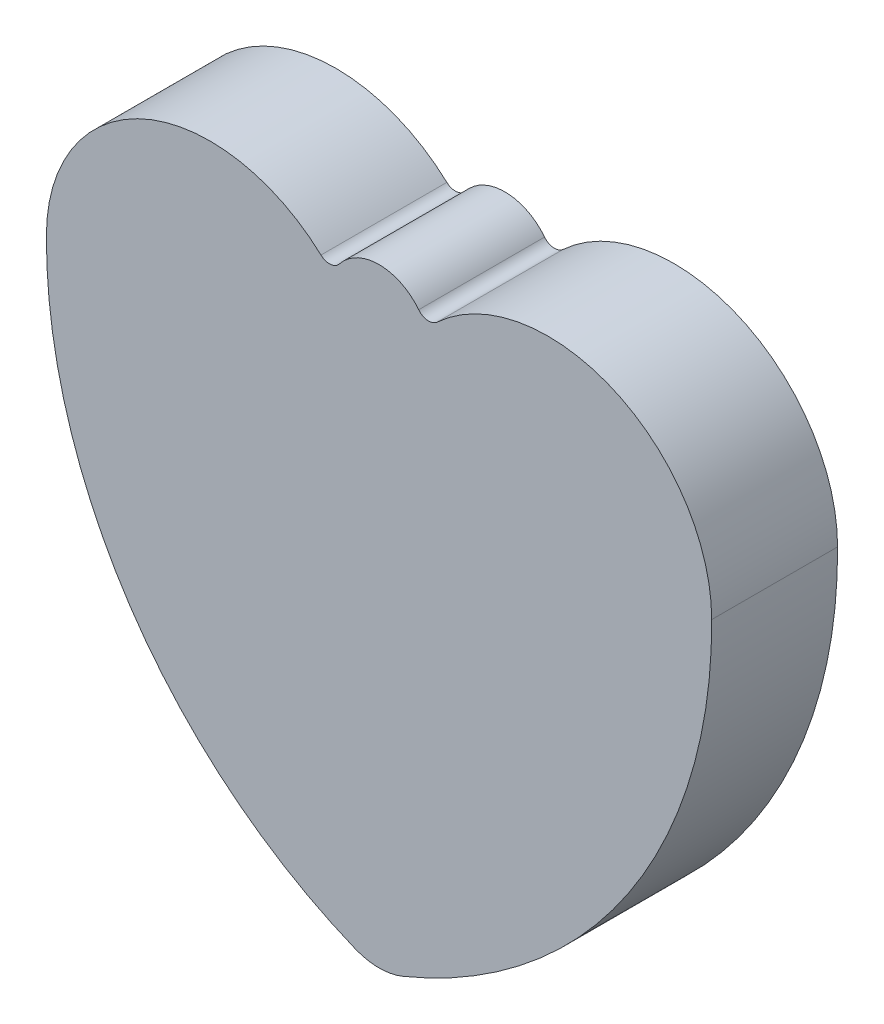
ISO-10303-21;
HEADER;
FILE_DESCRIPTION(('STEP AP214'),'2;1');
FILE_NAME('part.step','',(''),(''),'','','');
FILE_SCHEMA(('AUTOMOTIVE_DESIGN { 1 0 10303 214 1 1 1 1 }'));
ENDSEC;
DATA;
#1=APPLICATION_CONTEXT('core data for automotive mechanical design processes');
#2=APPLICATION_PROTOCOL_DEFINITION('international standard','automotive_design',2000,#1);
#3=PRODUCT_CONTEXT('',#1,'mechanical');
#4=PRODUCT('Part','Part','',(#3));
#5=PRODUCT_RELATED_PRODUCT_CATEGORY('part','',(#4));
#6=PRODUCT_DEFINITION_FORMATION('','',#4);
#7=PRODUCT_DEFINITION_CONTEXT('part definition',#1,'design');
#8=PRODUCT_DEFINITION('design','',#6,#7);
#9=PRODUCT_DEFINITION_SHAPE('','',#8);
#10=(LENGTH_UNIT() NAMED_UNIT(*) SI_UNIT(.MILLI.,.METRE.));
#11=(NAMED_UNIT(*) PLANE_ANGLE_UNIT() SI_UNIT($,.RADIAN.));
#12=(NAMED_UNIT(*) SI_UNIT($,.STERADIAN.) SOLID_ANGLE_UNIT());
#13=UNCERTAINTY_MEASURE_WITH_UNIT(LENGTH_MEASURE(1.E-05),#10,'distance_accuracy_value','');
#14=(GEOMETRIC_REPRESENTATION_CONTEXT(3) GLOBAL_UNCERTAINTY_ASSIGNED_CONTEXT((#13)) GLOBAL_UNIT_ASSIGNED_CONTEXT((#10,
#11,#12)) REPRESENTATION_CONTEXT('',''));
#15=CARTESIAN_POINT('',(0.,0.,0.));
#16=DIRECTION('',(0.,0.,1.));
#17=DIRECTION('',(1.,0.,0.));
#18=AXIS2_PLACEMENT_3D('',#15,#16,#17);
#19=CARTESIAN_POINT('',(3.3469414001685,20.5564627652285,9.25));
#20=DIRECTION('',(0.,0.,-1.));
#21=DIRECTION('',(-1.,0.,0.));
#22=AXIS2_PLACEMENT_3D('',#19,#20,#21);
#23=CYLINDRICAL_SURFACE('',#22,0.85);
#24=CARTESIAN_POINT('',(3.3469414001685,20.5564627652285,0.75));
#25=DIRECTION('',(0.,0.,-1.));
#26=DIRECTION('',(-1.,0.,0.));
#27=AXIS2_PLACEMENT_3D('',#24,#25,#26);
#28=CIRCLE('',#27,0.85);
#29=CARTESIAN_POINT('',(3.9230161604869,19.931452468894,0.75));
#30=VERTEX_POINT('',#29);
#31=CARTESIAN_POINT('',(2.6775531201348,20.032612280306,0.75));
#32=VERTEX_POINT('',#31);
#33=EDGE_CURVE('E131',#30,#32,#28,.T.);
#34=ORIENTED_EDGE('',*,*,#33,.T.);
#35=DIRECTION('',(0.,0.,-1.));
#36=VECTOR('',#35,1.);
#37=CARTESIAN_POINT('',(2.6775531201348,20.032612280306,9.25));
#38=LINE('',#37,#36);
#39=CARTESIAN_POINT('',(2.6775531201348,20.032612280306,9.25));
#40=VERTEX_POINT('',#39);
#41=EDGE_CURVE('E11',#40,#32,#38,.T.);
#42=ORIENTED_EDGE('',*,*,#41,.F.);
#43=CARTESIAN_POINT('',(3.3469414001685,20.5564627652285,9.25));
#44=DIRECTION('',(0.,0.,-1.));
#45=DIRECTION('',(-1.,0.,0.));
#46=AXIS2_PLACEMENT_3D('',#43,#44,#45);
#47=CIRCLE('',#46,0.85);
#48=CARTESIAN_POINT('',(3.9230161604869,19.931452468894,9.25));
#49=VERTEX_POINT('',#48);
#50=EDGE_CURVE('E145',#49,#40,#47,.T.);
#51=ORIENTED_EDGE('',*,*,#50,.F.);
#52=DIRECTION('',(0.,0.,-1.));
#53=VECTOR('',#52,1.);
#54=CARTESIAN_POINT('',(3.9230161604869,19.931452468894,9.25));
#55=LINE('',#54,#53);
#56=EDGE_CURVE('E127',#49,#30,#55,.T.);
#57=ORIENTED_EDGE('',*,*,#56,.T.);
#58=EDGE_LOOP('',(#34,#42,#51,#57));
#59=FACE_BOUND('',#58,.T.);
#60=ADVANCED_FACE('F35',(#59),#23,.F.);
#61=CARTESIAN_POINT('',(0.,17.937210340616,9.25));
#62=DIRECTION('',(0.,0.,-1.));
#63=DIRECTION('',(-1.,0.,0.));
#64=AXIS2_PLACEMENT_3D('',#61,#62,#63);
#65=CYLINDRICAL_SURFACE('',#64,3.4);
#66=CARTESIAN_POINT('',(0.,17.937210340616,0.75));
#67=DIRECTION('',(0.,0.,1.));
#68=DIRECTION('',(-1.,0.,0.));
#69=AXIS2_PLACEMENT_3D('',#66,#67,#68);
#70=CIRCLE('',#69,3.4);
#71=CARTESIAN_POINT('',(-2.67755312013479,20.032612280306,0.75));
#72=VERTEX_POINT('',#71);
#73=EDGE_CURVE('E134',#32,#72,#70,.T.);
#74=ORIENTED_EDGE('',*,*,#73,.T.);
#75=DIRECTION('',(0.,0.,-1.));
#76=VECTOR('',#75,1.);
#77=CARTESIAN_POINT('',(-2.67755312013479,20.032612280306,9.25));
#78=LINE('',#77,#76);
#79=CARTESIAN_POINT('',(-2.67755312013479,20.032612280306,9.25));
#80=VERTEX_POINT('',#79);
#81=EDGE_CURVE('E43',#80,#72,#78,.T.);
#82=ORIENTED_EDGE('',*,*,#81,.F.);
#83=CARTESIAN_POINT('',(0.,17.937210340616,9.25));
#84=DIRECTION('',(0.,0.,1.));
#85=DIRECTION('',(-1.,0.,0.));
#86=AXIS2_PLACEMENT_3D('',#83,#84,#85);
#87=CIRCLE('',#86,3.4);
#88=EDGE_CURVE('E94',#40,#80,#87,.T.);
#89=ORIENTED_EDGE('',*,*,#88,.F.);
#90=ORIENTED_EDGE('',*,*,#41,.T.);
#91=EDGE_LOOP('',(#74,#82,#89,#90));
#92=FACE_BOUND('',#91,.T.);
#93=ADVANCED_FACE('F180',(#92),#65,.T.);
#94=CARTESIAN_POINT('',(-3.34694140016849,20.5564627652285,9.25));
#95=DIRECTION('',(0.,0.,-1.));
#96=DIRECTION('',(-1.,0.,0.));
#97=AXIS2_PLACEMENT_3D('',#94,#95,#96);
#98=CYLINDRICAL_SURFACE('',#97,0.85);
#99=CARTESIAN_POINT('',(-3.34694140016849,20.5564627652285,0.75));
#100=DIRECTION('',(0.,0.,-1.));
#101=DIRECTION('',(-1.,0.,0.));
#102=AXIS2_PLACEMENT_3D('',#99,#100,#101);
#103=CIRCLE('',#102,0.85);
#104=CARTESIAN_POINT('',(-3.9230161604869,19.931452468894,0.75));
#105=VERTEX_POINT('',#104);
#106=EDGE_CURVE('E136',#72,#105,#103,.T.);
#107=ORIENTED_EDGE('',*,*,#106,.T.);
#108=DIRECTION('',(0.,0.,-1.));
#109=VECTOR('',#108,1.);
#110=CARTESIAN_POINT('',(-3.9230161604869,19.931452468894,9.25));
#111=LINE('',#110,#109);
#112=CARTESIAN_POINT('',(-3.9230161604869,19.931452468894,9.25));
#113=VERTEX_POINT('',#112);
#114=EDGE_CURVE('E152',#113,#105,#111,.T.);
#115=ORIENTED_EDGE('',*,*,#114,.F.);
#116=CARTESIAN_POINT('',(-3.34694140016849,20.5564627652285,9.25));
#117=DIRECTION('',(0.,0.,-1.));
#118=DIRECTION('',(-1.,0.,0.));
#119=AXIS2_PLACEMENT_3D('',#116,#117,#118);
#120=CIRCLE('',#119,0.85);
#121=EDGE_CURVE('E160',#80,#113,#120,.T.);
#122=ORIENTED_EDGE('',*,*,#121,.F.);
#123=ORIENTED_EDGE('',*,*,#81,.T.);
#124=EDGE_LOOP('',(#107,#115,#122,#123));
#125=FACE_BOUND('',#124,.T.);
#126=ADVANCED_FACE('F158',(#125),#98,.F.);
#127=CARTESIAN_POINT('',(-11.4119880446262,11.806318616546,9.25));
#128=DIRECTION('',(0.,0.,-1.));
#129=DIRECTION('',(-1.,0.,0.));
#130=AXIS2_PLACEMENT_3D('',#127,#128,#129);
#131=CYLINDRICAL_SURFACE('',#130,11.05);
#132=CARTESIAN_POINT('',(-11.4119880446262,11.806318616546,0.75));
#133=DIRECTION('',(0.,0.,1.));
#134=DIRECTION('',(1.,0.,0.));
#135=AXIS2_PLACEMENT_3D('',#132,#133,#134);
#136=CIRCLE('',#135,11.05);
#137=CARTESIAN_POINT('',(-22.4619880446262,11.806318616546,0.75));
#138=VERTEX_POINT('',#137);
#139=EDGE_CURVE('E138',#105,#138,#136,.T.);
#140=ORIENTED_EDGE('',*,*,#139,.T.);
#141=DIRECTION('',(0.,0.,-1.));
#142=VECTOR('',#141,1.);
#143=CARTESIAN_POINT('',(-22.4619880446262,11.806318616546,9.25));
#144=LINE('',#143,#142);
#145=CARTESIAN_POINT('',(-22.4619880446262,11.806318616546,9.25));
#146=VERTEX_POINT('',#145);
#147=EDGE_CURVE('E149',#146,#138,#144,.T.);
#148=ORIENTED_EDGE('',*,*,#147,.F.);
#149=CARTESIAN_POINT('',(-11.4119880446262,11.806318616546,9.25));
#150=DIRECTION('',(0.,0.,1.));
#151=DIRECTION('',(1.,0.,0.));
#152=AXIS2_PLACEMENT_3D('',#149,#150,#151);
#153=CIRCLE('',#152,11.05);
#154=EDGE_CURVE('E172',#113,#146,#153,.T.);
#155=ORIENTED_EDGE('',*,*,#154,.F.);
#156=ORIENTED_EDGE('',*,*,#114,.T.);
#157=EDGE_LOOP('',(#140,#148,#155,#156));
#158=FACE_BOUND('',#157,.T.);
#159=ADVANCED_FACE('F168',(#158),#131,.T.);
#160=CARTESIAN_POINT('',(11.1277021329412,11.5980011689559,9.25));
#161=DIRECTION('',(0.,0.,-1.));
#162=DIRECTION('',(-1.,0.,0.));
#163=AXIS2_PLACEMENT_3D('',#160,#161,#162);
#164=CYLINDRICAL_SURFACE('',#163,33.5903361457419);
#165=CARTESIAN_POINT('',(11.1277021329412,11.5980011689559,0.75));
#166=DIRECTION('',(0.,0.,1.));
#167=DIRECTION('',(-1.,0.,0.));
#168=AXIS2_PLACEMENT_3D('',#165,#166,#167);
#169=CIRCLE('',#168,33.5903361457419);
#170=CARTESIAN_POINT('',(-1.61186749293134,-19.4827653616733,0.75));
#171=VERTEX_POINT('',#170);
#172=EDGE_CURVE('E140',#138,#171,#169,.T.);
#173=ORIENTED_EDGE('',*,*,#172,.T.);
#174=DIRECTION('',(0.,0.,-1.));
#175=VECTOR('',#174,1.);
#176=CARTESIAN_POINT('',(-1.61186749293134,-19.4827653616733,9.25));
#177=LINE('',#176,#175);
#178=CARTESIAN_POINT('',(-1.61186749293134,-19.4827653616733,9.25));
#179=VERTEX_POINT('',#178);
#180=EDGE_CURVE('E122',#179,#171,#177,.T.);
#181=ORIENTED_EDGE('',*,*,#180,.F.);
#182=CARTESIAN_POINT('',(11.1277021329412,11.5980011689559,9.25));
#183=DIRECTION('',(0.,0.,1.));
#184=DIRECTION('',(-1.,0.,0.));
#185=AXIS2_PLACEMENT_3D('',#182,#183,#184);
#186=CIRCLE('',#185,33.5903361457419);
#187=EDGE_CURVE('E113',#146,#179,#186,.T.);
#188=ORIENTED_EDGE('',*,*,#187,.F.);
#189=ORIENTED_EDGE('',*,*,#147,.T.);
#190=EDGE_LOOP('',(#173,#181,#188,#189));
#191=FACE_BOUND('',#190,.T.);
#192=ADVANCED_FACE('F171',(#191),#164,.T.);
#193=CARTESIAN_POINT('',(0.,-15.5502873661556,9.25));
#194=DIRECTION('',(0.,0.,-1.));
#195=DIRECTION('',(-1.,0.,0.));
#196=AXIS2_PLACEMENT_3D('',#193,#194,#195);
#197=CYLINDRICAL_SURFACE('',#196,4.25);
#198=CARTESIAN_POINT('',(0.,-15.5502873661556,0.75));
#199=DIRECTION('',(0.,0.,1.));
#200=DIRECTION('',(-1.,0.,0.));
#201=AXIS2_PLACEMENT_3D('',#198,#199,#200);
#202=CIRCLE('',#201,4.25);
#203=CARTESIAN_POINT('',(1.61186749293133,-19.4827653616733,0.75));
#204=VERTEX_POINT('',#203);
#205=EDGE_CURVE('E121',#171,#204,#202,.T.);
#206=ORIENTED_EDGE('',*,*,#205,.T.);
#207=DIRECTION('',(0.,0.,-1.));
#208=VECTOR('',#207,1.);
#209=CARTESIAN_POINT('',(1.61186749293133,-19.4827653616733,9.25));
#210=LINE('',#209,#208);
#211=CARTESIAN_POINT('',(1.61186749293133,-19.4827653616733,9.25));
#212=VERTEX_POINT('',#211);
#213=EDGE_CURVE('E118',#212,#204,#210,.T.);
#214=ORIENTED_EDGE('',*,*,#213,.F.);
#215=CARTESIAN_POINT('',(0.,-15.5502873661556,9.25));
#216=DIRECTION('',(0.,0.,1.));
#217=DIRECTION('',(-1.,0.,0.));
#218=AXIS2_PLACEMENT_3D('',#215,#216,#217);
#219=CIRCLE('',#218,4.25);
#220=EDGE_CURVE('E107',#179,#212,#219,.T.);
#221=ORIENTED_EDGE('',*,*,#220,.F.);
#222=ORIENTED_EDGE('',*,*,#180,.T.);
#223=EDGE_LOOP('',(#206,#214,#221,#222));
#224=FACE_BOUND('',#223,.T.);
#225=ADVANCED_FACE('F119',(#224),#197,.T.);
#226=CARTESIAN_POINT('',(-11.1277021329412,11.5980011689559,9.25));
#227=DIRECTION('',(0.,0.,-1.));
#228=DIRECTION('',(-1.,0.,0.));
#229=AXIS2_PLACEMENT_3D('',#226,#227,#228);
#230=CYLINDRICAL_SURFACE('',#229,33.5903361457419);
#231=CARTESIAN_POINT('',(-11.1277021329412,11.5980011689559,0.75));
#232=DIRECTION('',(0.,0.,1.));
#233=DIRECTION('',(1.,0.,0.));
#234=AXIS2_PLACEMENT_3D('',#231,#232,#233);
#235=CIRCLE('',#234,33.5903361457419);
#236=CARTESIAN_POINT('',(22.4619880446262,11.806318616546,0.75));
#237=VERTEX_POINT('',#236);
#238=EDGE_CURVE('E80',#204,#237,#235,.T.);
#239=ORIENTED_EDGE('',*,*,#238,.T.);
#240=DIRECTION('',(0.,0.,-1.));
#241=VECTOR('',#240,1.);
#242=CARTESIAN_POINT('',(22.4619880446262,11.806318616546,9.25));
#243=LINE('',#242,#241);
#244=CARTESIAN_POINT('',(22.4619880446262,11.806318616546,9.25));
#245=VERTEX_POINT('',#244);
#246=EDGE_CURVE('E123',#245,#237,#243,.T.);
#247=ORIENTED_EDGE('',*,*,#246,.F.);
#248=CARTESIAN_POINT('',(-11.1277021329412,11.5980011689559,9.25));
#249=DIRECTION('',(0.,0.,1.));
#250=DIRECTION('',(1.,0.,0.));
#251=AXIS2_PLACEMENT_3D('',#248,#249,#250);
#252=CIRCLE('',#251,33.5903361457419);
#253=EDGE_CURVE('E111',#212,#245,#252,.T.);
#254=ORIENTED_EDGE('',*,*,#253,.F.);
#255=ORIENTED_EDGE('',*,*,#213,.T.);
#256=EDGE_LOOP('',(#239,#247,#254,#255));
#257=FACE_BOUND('',#256,.T.);
#258=ADVANCED_FACE('F125',(#257),#230,.T.);
#259=CARTESIAN_POINT('',(11.4119880446262,11.806318616546,9.25));
#260=DIRECTION('',(0.,0.,-1.));
#261=DIRECTION('',(-1.,0.,0.));
#262=AXIS2_PLACEMENT_3D('',#259,#260,#261);
#263=CYLINDRICAL_SURFACE('',#262,11.05);
#264=CARTESIAN_POINT('',(11.4119880446262,11.806318616546,0.75));
#265=DIRECTION('',(0.,0.,1.));
#266=DIRECTION('',(-1.,0.,0.));
#267=AXIS2_PLACEMENT_3D('',#264,#265,#266);
#268=CIRCLE('',#267,11.05);
#269=EDGE_CURVE('E86',#237,#30,#268,.T.);
#270=ORIENTED_EDGE('',*,*,#269,.T.);
#271=ORIENTED_EDGE('',*,*,#56,.F.);
#272=CARTESIAN_POINT('',(11.4119880446262,11.806318616546,9.25));
#273=DIRECTION('',(0.,0.,1.));
#274=DIRECTION('',(-1.,0.,0.));
#275=AXIS2_PLACEMENT_3D('',#272,#273,#274);
#276=CIRCLE('',#275,11.05);
#277=EDGE_CURVE('E51',#245,#49,#276,.T.);
#278=ORIENTED_EDGE('',*,*,#277,.F.);
#279=ORIENTED_EDGE('',*,*,#246,.T.);
#280=EDGE_LOOP('',(#270,#271,#278,#279));
#281=FACE_BOUND('',#280,.T.);
#282=ADVANCED_FACE('F196',(#281),#263,.T.);
#283=CARTESIAN_POINT('',(1.67347070008425,19.2468365529222,9.25));
#284=DIRECTION('',(0.,0.,-1.));
#285=DIRECTION('',(-1.,0.,0.));
#286=AXIS2_PLACEMENT_3D('',#283,#284,#285);
#287=PLANE('',#286);
#288=ORIENTED_EDGE('',*,*,#50,.T.);
#289=ORIENTED_EDGE('',*,*,#88,.T.);
#290=ORIENTED_EDGE('',*,*,#121,.T.);
#291=ORIENTED_EDGE('',*,*,#154,.T.);
#292=ORIENTED_EDGE('',*,*,#187,.T.);
#293=ORIENTED_EDGE('',*,*,#220,.T.);
#294=ORIENTED_EDGE('',*,*,#253,.T.);
#295=ORIENTED_EDGE('',*,*,#277,.T.);
#296=EDGE_LOOP('',(#288,#289,#290,#291,#292,#293,#294,#295));
#297=FACE_BOUND('',#296,.T.);
#298=ADVANCED_FACE('F109',(#297),#287,.F.);
#299=CARTESIAN_POINT('',(1.67347070008425,19.2468365529222,0.75));
#300=DIRECTION('',(0.,0.,-1.));
#301=DIRECTION('',(-1.,0.,0.));
#302=AXIS2_PLACEMENT_3D('',#299,#300,#301);
#303=PLANE('',#302);
#304=ORIENTED_EDGE('',*,*,#33,.F.);
#305=ORIENTED_EDGE('',*,*,#269,.F.);
#306=ORIENTED_EDGE('',*,*,#238,.F.);
#307=ORIENTED_EDGE('',*,*,#205,.F.);
#308=ORIENTED_EDGE('',*,*,#172,.F.);
#309=ORIENTED_EDGE('',*,*,#139,.F.);
#310=ORIENTED_EDGE('',*,*,#106,.F.);
#311=ORIENTED_EDGE('',*,*,#73,.F.);
#312=EDGE_LOOP('',(#304,#305,#306,#307,#308,#309,#310,#311));
#313=FACE_BOUND('',#312,.T.);
#314=ADVANCED_FACE('F164',(#313),#303,.T.);
#315=CLOSED_SHELL('',(#60,#93,#126,#159,#192,#225,#258,#282,#298,#314));
#316=MANIFOLD_SOLID_BREP('B2',#315);
#317=ADVANCED_BREP_SHAPE_REPRESENTATION('',(#18,#316),#14);
#318=SHAPE_DEFINITION_REPRESENTATION(#9,#317);
ENDSEC;
END-ISO-10303-21;
